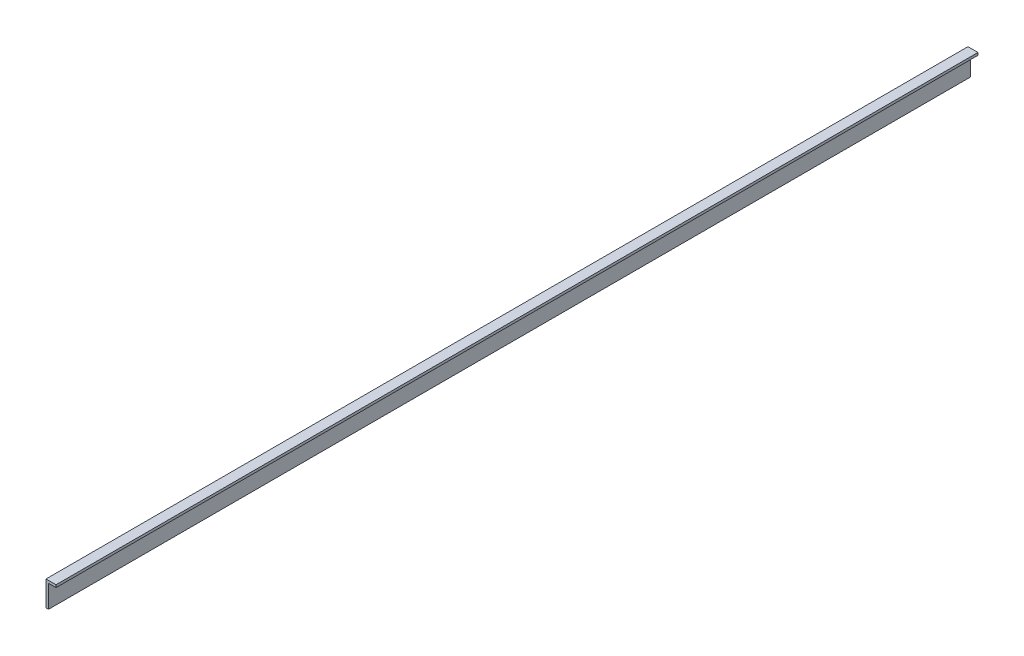
ISO-10303-21;
HEADER;
FILE_DESCRIPTION(('STEP AP214'),'2;1');
FILE_NAME('part.step','',(''),(''),'','','');
FILE_SCHEMA(('AUTOMOTIVE_DESIGN { 1 0 10303 214 1 1 1 1 }'));
ENDSEC;
DATA;
#1=APPLICATION_CONTEXT('core data for automotive mechanical design processes');
#2=APPLICATION_PROTOCOL_DEFINITION('international standard','automotive_design',2000,#1);
#3=PRODUCT_CONTEXT('',#1,'mechanical');
#4=PRODUCT('Part','Part','',(#3));
#5=PRODUCT_RELATED_PRODUCT_CATEGORY('part','',(#4));
#6=PRODUCT_DEFINITION_FORMATION('','',#4);
#7=PRODUCT_DEFINITION_CONTEXT('part definition',#1,'design');
#8=PRODUCT_DEFINITION('design','',#6,#7);
#9=PRODUCT_DEFINITION_SHAPE('','',#8);
#10=(LENGTH_UNIT() NAMED_UNIT(*) SI_UNIT(.MILLI.,.METRE.));
#11=(NAMED_UNIT(*) PLANE_ANGLE_UNIT() SI_UNIT($,.RADIAN.));
#12=(NAMED_UNIT(*) SI_UNIT($,.STERADIAN.) SOLID_ANGLE_UNIT());
#13=UNCERTAINTY_MEASURE_WITH_UNIT(LENGTH_MEASURE(1.E-05),#10,'distance_accuracy_value','');
#14=(GEOMETRIC_REPRESENTATION_CONTEXT(3) GLOBAL_UNCERTAINTY_ASSIGNED_CONTEXT((#13)) GLOBAL_UNIT_ASSIGNED_CONTEXT((#10,
#11,#12)) REPRESENTATION_CONTEXT('',''));
#15=CARTESIAN_POINT('',(0.,0.,0.));
#16=DIRECTION('',(0.,0.,1.));
#17=DIRECTION('',(1.,0.,0.));
#18=AXIS2_PLACEMENT_3D('',#15,#16,#17);
#19=CARTESIAN_POINT('',(97.5,422.5,-755.5));
#20=DIRECTION('',(1.,0.,0.));
#21=DIRECTION('',(0.,0.,-1.));
#22=AXIS2_PLACEMENT_3D('',#19,#20,#21);
#23=PLANE('',#22);
#24=DIRECTION('',(0.,1.,0.));
#25=VECTOR('',#24,1.);
#26=CARTESIAN_POINT('',(97.5,422.5,-20.));
#27=LINE('',#26,#25);
#28=CARTESIAN_POINT('',(97.5,404.5,-20.));
#29=VERTEX_POINT('',#28);
#30=CARTESIAN_POINT('',(97.5,422.5,-20.));
#31=VERTEX_POINT('',#30);
#32=EDGE_CURVE('E124',#29,#31,#27,.T.);
#33=ORIENTED_EDGE('',*,*,#32,.F.);
#34=DIRECTION('',(0.,0.,1.));
#35=VECTOR('',#34,1.);
#36=CARTESIAN_POINT('',(97.5,404.5,-755.5));
#37=LINE('',#36,#35);
#38=CARTESIAN_POINT('',(97.5,404.5,-755.5));
#39=VERTEX_POINT('',#38);
#40=EDGE_CURVE('E11',#39,#29,#37,.T.);
#41=ORIENTED_EDGE('',*,*,#40,.F.);
#42=DIRECTION('',(0.,1.,0.));
#43=VECTOR('',#42,1.);
#44=CARTESIAN_POINT('',(97.5,422.5,-755.5));
#45=LINE('',#44,#43);
#46=CARTESIAN_POINT('',(97.5,422.5,-755.5));
#47=VERTEX_POINT('',#46);
#48=EDGE_CURVE('E138',#39,#47,#45,.T.);
#49=ORIENTED_EDGE('',*,*,#48,.T.);
#50=DIRECTION('',(0.,0.,1.));
#51=VECTOR('',#50,1.);
#52=CARTESIAN_POINT('',(97.5,422.5,-755.5));
#53=LINE('',#52,#51);
#54=EDGE_CURVE('E42',#47,#31,#53,.T.);
#55=ORIENTED_EDGE('',*,*,#54,.T.);
#56=EDGE_LOOP('',(#33,#41,#49,#55));
#57=FACE_BOUND('',#56,.T.);
#58=ADVANCED_FACE('F39',(#57),#23,.T.);
#59=CARTESIAN_POINT('',(97.5,404.5,-755.5));
#60=DIRECTION('',(0.,-1.,0.));
#61=DIRECTION('',(0.,0.,-1.));
#62=AXIS2_PLACEMENT_3D('',#59,#60,#61);
#63=PLANE('',#62);
#64=DIRECTION('',(1.,0.,0.));
#65=VECTOR('',#64,1.);
#66=CARTESIAN_POINT('',(97.5,404.5,-20.));
#67=LINE('',#66,#65);
#68=CARTESIAN_POINT('',(95.5,404.5,-20.));
#69=VERTEX_POINT('',#68);
#70=EDGE_CURVE('E136',#69,#29,#67,.T.);
#71=ORIENTED_EDGE('',*,*,#70,.F.);
#72=DIRECTION('',(0.,0.,1.));
#73=VECTOR('',#72,1.);
#74=CARTESIAN_POINT('',(95.5,404.5,-755.5));
#75=LINE('',#74,#73);
#76=CARTESIAN_POINT('',(95.5,404.5,-755.5));
#77=VERTEX_POINT('',#76);
#78=EDGE_CURVE('E48',#77,#69,#75,.T.);
#79=ORIENTED_EDGE('',*,*,#78,.F.);
#80=DIRECTION('',(1.,0.,0.));
#81=VECTOR('',#80,1.);
#82=CARTESIAN_POINT('',(97.5,404.5,-755.5));
#83=LINE('',#82,#81);
#84=EDGE_CURVE('E114',#77,#39,#83,.T.);
#85=ORIENTED_EDGE('',*,*,#84,.T.);
#86=ORIENTED_EDGE('',*,*,#40,.T.);
#87=EDGE_LOOP('',(#71,#79,#85,#86));
#88=FACE_BOUND('',#87,.T.);
#89=ADVANCED_FACE('F146',(#88),#63,.T.);
#90=CARTESIAN_POINT('',(95.5,404.5,-755.5));
#91=DIRECTION('',(-1.,0.,0.));
#92=DIRECTION('',(0.,0.,1.));
#93=AXIS2_PLACEMENT_3D('',#90,#91,#92);
#94=PLANE('',#93);
#95=DIRECTION('',(0.,-1.,0.));
#96=VECTOR('',#95,1.);
#97=CARTESIAN_POINT('',(95.5,404.5,-20.));
#98=LINE('',#97,#96);
#99=CARTESIAN_POINT('',(95.5,424.5,-20.));
#100=VERTEX_POINT('',#99);
#101=EDGE_CURVE('E101',#100,#69,#98,.T.);
#102=ORIENTED_EDGE('',*,*,#101,.F.);
#103=DIRECTION('',(0.,0.,1.));
#104=VECTOR('',#103,1.);
#105=CARTESIAN_POINT('',(95.5,424.5,-755.5));
#106=LINE('',#105,#104);
#107=CARTESIAN_POINT('',(95.5,424.5,-755.5));
#108=VERTEX_POINT('',#107);
#109=EDGE_CURVE('E96',#108,#100,#106,.T.);
#110=ORIENTED_EDGE('',*,*,#109,.F.);
#111=DIRECTION('',(0.,-1.,0.));
#112=VECTOR('',#111,1.);
#113=CARTESIAN_POINT('',(95.5,404.5,-755.5));
#114=LINE('',#113,#112);
#115=EDGE_CURVE('E99',#108,#77,#114,.T.);
#116=ORIENTED_EDGE('',*,*,#115,.T.);
#117=ORIENTED_EDGE('',*,*,#78,.T.);
#118=EDGE_LOOP('',(#102,#110,#116,#117));
#119=FACE_BOUND('',#118,.T.);
#120=ADVANCED_FACE('F98',(#119),#94,.T.);
#121=CARTESIAN_POINT('',(95.5,424.5,-755.5));
#122=DIRECTION('',(0.,1.,0.));
#123=DIRECTION('',(0.,0.,1.));
#124=AXIS2_PLACEMENT_3D('',#121,#122,#123);
#125=PLANE('',#124);
#126=DIRECTION('',(-1.,0.,0.));
#127=VECTOR('',#126,1.);
#128=CARTESIAN_POINT('',(95.5,424.5,-20.));
#129=LINE('',#128,#127);
#130=CARTESIAN_POINT('',(103.5,424.5,-20.));
#131=VERTEX_POINT('',#130);
#132=EDGE_CURVE('E133',#131,#100,#129,.T.);
#133=ORIENTED_EDGE('',*,*,#132,.F.);
#134=DIRECTION('',(0.,0.,1.));
#135=VECTOR('',#134,1.);
#136=CARTESIAN_POINT('',(103.5,424.5,-755.5));
#137=LINE('',#136,#135);
#138=CARTESIAN_POINT('',(103.5,424.5,-755.5));
#139=VERTEX_POINT('',#138);
#140=EDGE_CURVE('E106',#139,#131,#137,.T.);
#141=ORIENTED_EDGE('',*,*,#140,.F.);
#142=DIRECTION('',(-1.,0.,0.));
#143=VECTOR('',#142,1.);
#144=CARTESIAN_POINT('',(95.5,424.5,-755.5));
#145=LINE('',#144,#143);
#146=EDGE_CURVE('E112',#139,#108,#145,.T.);
#147=ORIENTED_EDGE('',*,*,#146,.T.);
#148=ORIENTED_EDGE('',*,*,#109,.T.);
#149=EDGE_LOOP('',(#133,#141,#147,#148));
#150=FACE_BOUND('',#149,.T.);
#151=ADVANCED_FACE('F116',(#150),#125,.T.);
#152=CARTESIAN_POINT('',(103.5,424.5,-755.5));
#153=DIRECTION('',(1.,0.,0.));
#154=DIRECTION('',(0.,0.,-1.));
#155=AXIS2_PLACEMENT_3D('',#152,#153,#154);
#156=PLANE('',#155);
#157=DIRECTION('',(0.,1.,0.));
#158=VECTOR('',#157,1.);
#159=CARTESIAN_POINT('',(103.5,424.5,-20.));
#160=LINE('',#159,#158);
#161=CARTESIAN_POINT('',(103.5,422.5,-20.));
#162=VERTEX_POINT('',#161);
#163=EDGE_CURVE('E130',#162,#131,#160,.T.);
#164=ORIENTED_EDGE('',*,*,#163,.F.);
#165=DIRECTION('',(0.,0.,1.));
#166=VECTOR('',#165,1.);
#167=CARTESIAN_POINT('',(103.5,422.5,-755.5));
#168=LINE('',#167,#166);
#169=CARTESIAN_POINT('',(103.5,422.5,-755.5));
#170=VERTEX_POINT('',#169);
#171=EDGE_CURVE('E141',#170,#162,#168,.T.);
#172=ORIENTED_EDGE('',*,*,#171,.F.);
#173=DIRECTION('',(0.,1.,0.));
#174=VECTOR('',#173,1.);
#175=CARTESIAN_POINT('',(103.5,424.5,-755.5));
#176=LINE('',#175,#174);
#177=EDGE_CURVE('E117',#170,#139,#176,.T.);
#178=ORIENTED_EDGE('',*,*,#177,.T.);
#179=ORIENTED_EDGE('',*,*,#140,.T.);
#180=EDGE_LOOP('',(#164,#172,#178,#179));
#181=FACE_BOUND('',#180,.T.);
#182=ADVANCED_FACE('F159',(#181),#156,.T.);
#183=CARTESIAN_POINT('',(103.5,422.5,-755.5));
#184=DIRECTION('',(0.,-1.,0.));
#185=DIRECTION('',(0.,0.,-1.));
#186=AXIS2_PLACEMENT_3D('',#183,#184,#185);
#187=PLANE('',#186);
#188=DIRECTION('',(1.,0.,0.));
#189=VECTOR('',#188,1.);
#190=CARTESIAN_POINT('',(103.5,422.5,-20.));
#191=LINE('',#190,#189);
#192=EDGE_CURVE('E127',#31,#162,#191,.T.);
#193=ORIENTED_EDGE('',*,*,#192,.F.);
#194=ORIENTED_EDGE('',*,*,#54,.F.);
#195=DIRECTION('',(1.,0.,0.));
#196=VECTOR('',#195,1.);
#197=CARTESIAN_POINT('',(103.5,422.5,-755.5));
#198=LINE('',#197,#196);
#199=EDGE_CURVE('E119',#47,#170,#198,.T.);
#200=ORIENTED_EDGE('',*,*,#199,.T.);
#201=ORIENTED_EDGE('',*,*,#171,.T.);
#202=EDGE_LOOP('',(#193,#194,#200,#201));
#203=FACE_BOUND('',#202,.T.);
#204=ADVANCED_FACE('F143',(#203),#187,.T.);
#205=CARTESIAN_POINT('',(0.,0.,-755.5));
#206=DIRECTION('',(0.,0.,-1.));
#207=DIRECTION('',(-1.,0.,0.));
#208=AXIS2_PLACEMENT_3D('',#205,#206,#207);
#209=PLANE('',#208);
#210=ORIENTED_EDGE('',*,*,#48,.F.);
#211=ORIENTED_EDGE('',*,*,#84,.F.);
#212=ORIENTED_EDGE('',*,*,#115,.F.);
#213=ORIENTED_EDGE('',*,*,#146,.F.);
#214=ORIENTED_EDGE('',*,*,#177,.F.);
#215=ORIENTED_EDGE('',*,*,#199,.F.);
#216=EDGE_LOOP('',(#210,#211,#212,#213,#214,#215));
#217=FACE_BOUND('',#216,.T.);
#218=ADVANCED_FACE('F110',(#217),#209,.T.);
#219=CARTESIAN_POINT('',(0.,0.,-20.));
#220=DIRECTION('',(0.,0.,-1.));
#221=DIRECTION('',(-1.,0.,0.));
#222=AXIS2_PLACEMENT_3D('',#219,#220,#221);
#223=PLANE('',#222);
#224=ORIENTED_EDGE('',*,*,#32,.T.);
#225=ORIENTED_EDGE('',*,*,#192,.T.);
#226=ORIENTED_EDGE('',*,*,#163,.T.);
#227=ORIENTED_EDGE('',*,*,#132,.T.);
#228=ORIENTED_EDGE('',*,*,#101,.T.);
#229=ORIENTED_EDGE('',*,*,#70,.T.);
#230=EDGE_LOOP('',(#224,#225,#226,#227,#228,#229));
#231=FACE_BOUND('',#230,.T.);
#232=ADVANCED_FACE('F145',(#231),#223,.F.);
#233=CLOSED_SHELL('',(#58,#89,#120,#151,#182,#204,#218,#232));
#234=MANIFOLD_SOLID_BREP('B2',#233);
#235=ADVANCED_BREP_SHAPE_REPRESENTATION('',(#18,#234),#14);
#236=SHAPE_DEFINITION_REPRESENTATION(#9,#235);
ENDSEC;
END-ISO-10303-21;
